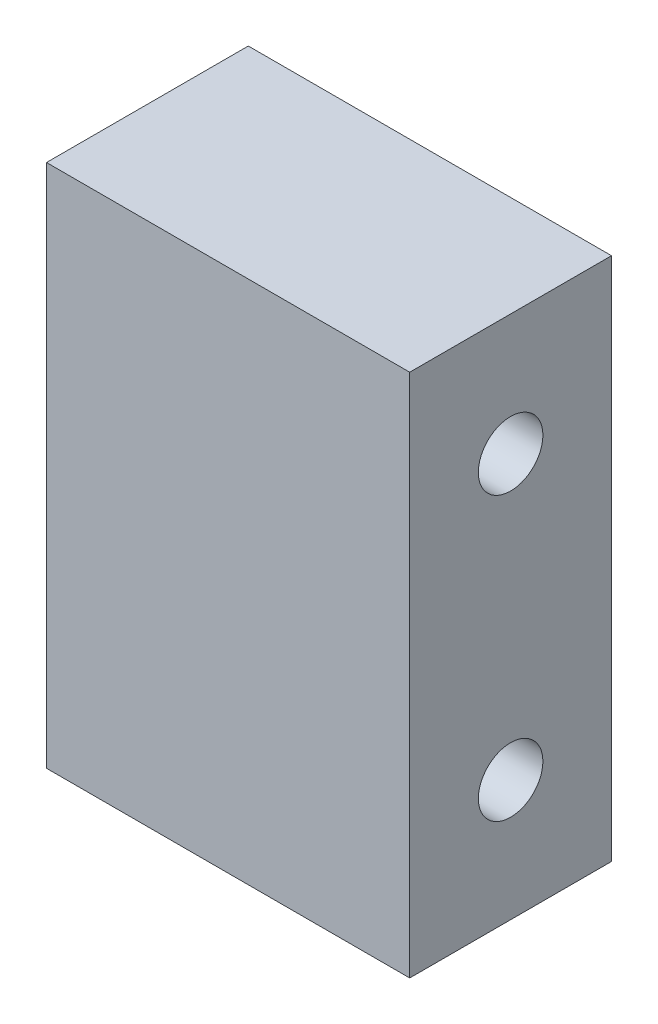
ISO-10303-21;
HEADER;
FILE_DESCRIPTION(('STEP AP214'),'2;1');
FILE_NAME('part.step','',(''),(''),'','','');
FILE_SCHEMA(('AUTOMOTIVE_DESIGN { 1 0 10303 214 1 1 1 1 }'));
ENDSEC;
DATA;
#1=APPLICATION_CONTEXT('core data for automotive mechanical design processes');
#2=APPLICATION_PROTOCOL_DEFINITION('international standard','automotive_design',2000,#1);
#3=PRODUCT_CONTEXT('',#1,'mechanical');
#4=PRODUCT('Part','Part','',(#3));
#5=PRODUCT_RELATED_PRODUCT_CATEGORY('part','',(#4));
#6=PRODUCT_DEFINITION_FORMATION('','',#4);
#7=PRODUCT_DEFINITION_CONTEXT('part definition',#1,'design');
#8=PRODUCT_DEFINITION('design','',#6,#7);
#9=PRODUCT_DEFINITION_SHAPE('','',#8);
#10=(LENGTH_UNIT() NAMED_UNIT(*) SI_UNIT(.MILLI.,.METRE.));
#11=(NAMED_UNIT(*) PLANE_ANGLE_UNIT() SI_UNIT($,.RADIAN.));
#12=(NAMED_UNIT(*) SI_UNIT($,.STERADIAN.) SOLID_ANGLE_UNIT());
#13=UNCERTAINTY_MEASURE_WITH_UNIT(LENGTH_MEASURE(1.E-05),#10,'distance_accuracy_value','');
#14=(GEOMETRIC_REPRESENTATION_CONTEXT(3) GLOBAL_UNCERTAINTY_ASSIGNED_CONTEXT((#13)) GLOBAL_UNIT_ASSIGNED_CONTEXT((#10,
#11,#12)) REPRESENTATION_CONTEXT('',''));
#15=CARTESIAN_POINT('',(0.,0.,0.));
#16=DIRECTION('',(0.,0.,1.));
#17=DIRECTION('',(1.,0.,0.));
#18=AXIS2_PLACEMENT_3D('',#15,#16,#17);
#19=CARTESIAN_POINT('',(0.,0.,25.));
#20=DIRECTION('',(1.,0.,0.));
#21=DIRECTION('',(0.,0.,-1.));
#22=AXIS2_PLACEMENT_3D('',#19,#20,#21);
#23=PLANE('',#22);
#24=DIRECTION('',(0.,-1.,0.));
#25=VECTOR('',#24,1.);
#26=CARTESIAN_POINT('',(0.,0.,0.));
#27=LINE('',#26,#25);
#28=CARTESIAN_POINT('',(0.,65.,0.));
#29=VERTEX_POINT('',#28);
#30=CARTESIAN_POINT('',(0.,0.,0.));
#31=VERTEX_POINT('',#30);
#32=EDGE_CURVE('E96',#29,#31,#27,.T.);
#33=ORIENTED_EDGE('',*,*,#32,.T.);
#34=DIRECTION('',(0.,0.,-1.));
#35=VECTOR('',#34,1.);
#36=CARTESIAN_POINT('',(0.,0.,25.));
#37=LINE('',#36,#35);
#38=CARTESIAN_POINT('',(0.,0.,25.));
#39=VERTEX_POINT('',#38);
#40=EDGE_CURVE('E11',#39,#31,#37,.T.);
#41=ORIENTED_EDGE('',*,*,#40,.F.);
#42=DIRECTION('',(0.,-1.,0.));
#43=VECTOR('',#42,1.);
#44=CARTESIAN_POINT('',(0.,0.,25.));
#45=LINE('',#44,#43);
#46=CARTESIAN_POINT('',(0.,65.,25.));
#47=VERTEX_POINT('',#46);
#48=EDGE_CURVE('E84',#47,#39,#45,.T.);
#49=ORIENTED_EDGE('',*,*,#48,.F.);
#50=DIRECTION('',(0.,0.,-1.));
#51=VECTOR('',#50,1.);
#52=CARTESIAN_POINT('',(0.,65.,25.));
#53=LINE('',#52,#51);
#54=EDGE_CURVE('E92',#47,#29,#53,.T.);
#55=ORIENTED_EDGE('',*,*,#54,.T.);
#56=EDGE_LOOP('',(#33,#41,#49,#55));
#57=FACE_BOUND('',#56,.T.);
#58=ADVANCED_FACE('F33',(#57),#23,.F.);
#59=CARTESIAN_POINT('',(0.,0.,25.));
#60=DIRECTION('',(0.,1.,0.));
#61=DIRECTION('',(0.,0.,1.));
#62=AXIS2_PLACEMENT_3D('',#59,#60,#61);
#63=PLANE('',#62);
#64=DIRECTION('',(1.,0.,0.));
#65=VECTOR('',#64,1.);
#66=CARTESIAN_POINT('',(0.,0.,0.));
#67=LINE('',#66,#65);
#68=CARTESIAN_POINT('',(45.,0.,0.));
#69=VERTEX_POINT('',#68);
#70=EDGE_CURVE('E88',#31,#69,#67,.T.);
#71=ORIENTED_EDGE('',*,*,#70,.T.);
#72=DIRECTION('',(0.,0.,-1.));
#73=VECTOR('',#72,1.);
#74=CARTESIAN_POINT('',(45.,0.,25.));
#75=LINE('',#74,#73);
#76=CARTESIAN_POINT('',(45.,0.,25.));
#77=VERTEX_POINT('',#76);
#78=EDGE_CURVE('E41',#77,#69,#75,.T.);
#79=ORIENTED_EDGE('',*,*,#78,.F.);
#80=DIRECTION('',(1.,0.,0.));
#81=VECTOR('',#80,1.);
#82=CARTESIAN_POINT('',(0.,0.,25.));
#83=LINE('',#82,#81);
#84=EDGE_CURVE('E79',#39,#77,#83,.T.);
#85=ORIENTED_EDGE('',*,*,#84,.F.);
#86=ORIENTED_EDGE('',*,*,#40,.T.);
#87=EDGE_LOOP('',(#71,#79,#85,#86));
#88=FACE_BOUND('',#87,.T.);
#89=ADVANCED_FACE('F87',(#88),#63,.F.);
#90=CARTESIAN_POINT('',(45.,0.,25.));
#91=DIRECTION('',(-1.,0.,0.));
#92=DIRECTION('',(0.,0.,1.));
#93=AXIS2_PLACEMENT_3D('',#90,#91,#92);
#94=PLANE('',#93);
#95=CARTESIAN_POINT('',(45.,15.,12.5));
#96=DIRECTION('',(1.,0.,0.));
#97=DIRECTION('',(0.,0.,-1.));
#98=AXIS2_PLACEMENT_3D('',#95,#96,#97);
#99=CIRCLE('',#98,4.);
#100=CARTESIAN_POINT('',(45.,15.,8.5));
#101=VERTEX_POINT('',#100);
#102=EDGE_CURVE('E116',#101,#101,#99,.T.);
#103=ORIENTED_EDGE('',*,*,#102,.F.);
#104=EDGE_LOOP('',(#103));
#105=FACE_BOUND('',#104,.T.);
#106=CARTESIAN_POINT('',(45.,50.,12.5));
#107=DIRECTION('',(1.,0.,0.));
#108=DIRECTION('',(0.,0.,-1.));
#109=AXIS2_PLACEMENT_3D('',#106,#107,#108);
#110=CIRCLE('',#109,4.);
#111=CARTESIAN_POINT('',(45.,50.,8.5));
#112=VERTEX_POINT('',#111);
#113=EDGE_CURVE('E110',#112,#112,#110,.T.);
#114=ORIENTED_EDGE('',*,*,#113,.F.);
#115=EDGE_LOOP('',(#114));
#116=FACE_BOUND('',#115,.T.);
#117=DIRECTION('',(0.,1.,0.));
#118=VECTOR('',#117,1.);
#119=CARTESIAN_POINT('',(45.,0.,0.));
#120=LINE('',#119,#118);
#121=CARTESIAN_POINT('',(45.,65.,0.));
#122=VERTEX_POINT('',#121);
#123=EDGE_CURVE('E66',#69,#122,#120,.T.);
#124=ORIENTED_EDGE('',*,*,#123,.T.);
#125=DIRECTION('',(0.,0.,-1.));
#126=VECTOR('',#125,1.);
#127=CARTESIAN_POINT('',(45.,65.,25.));
#128=LINE('',#127,#126);
#129=CARTESIAN_POINT('',(45.,65.,25.));
#130=VERTEX_POINT('',#129);
#131=EDGE_CURVE('E89',#130,#122,#128,.T.);
#132=ORIENTED_EDGE('',*,*,#131,.F.);
#133=DIRECTION('',(0.,1.,0.));
#134=VECTOR('',#133,1.);
#135=CARTESIAN_POINT('',(45.,0.,25.));
#136=LINE('',#135,#134);
#137=EDGE_CURVE('E82',#77,#130,#136,.T.);
#138=ORIENTED_EDGE('',*,*,#137,.F.);
#139=ORIENTED_EDGE('',*,*,#78,.T.);
#140=EDGE_LOOP('',(#124,#132,#138,#139));
#141=FACE_BOUND('',#140,.T.);
#142=ADVANCED_FACE('F90',(#105,#116,#141),#94,.F.);
#143=CARTESIAN_POINT('',(0.,65.,25.));
#144=DIRECTION('',(0.,-1.,0.));
#145=DIRECTION('',(0.,0.,-1.));
#146=AXIS2_PLACEMENT_3D('',#143,#144,#145);
#147=PLANE('',#146);
#148=DIRECTION('',(-1.,0.,0.));
#149=VECTOR('',#148,1.);
#150=CARTESIAN_POINT('',(0.,65.,0.));
#151=LINE('',#150,#149);
#152=EDGE_CURVE('E72',#122,#29,#151,.T.);
#153=ORIENTED_EDGE('',*,*,#152,.T.);
#154=ORIENTED_EDGE('',*,*,#54,.F.);
#155=DIRECTION('',(-1.,0.,0.));
#156=VECTOR('',#155,1.);
#157=CARTESIAN_POINT('',(0.,65.,25.));
#158=LINE('',#157,#156);
#159=EDGE_CURVE('E49',#130,#47,#158,.T.);
#160=ORIENTED_EDGE('',*,*,#159,.F.);
#161=ORIENTED_EDGE('',*,*,#131,.T.);
#162=EDGE_LOOP('',(#153,#154,#160,#161));
#163=FACE_BOUND('',#162,.T.);
#164=ADVANCED_FACE('F104',(#163),#147,.F.);
#165=CARTESIAN_POINT('',(0.,0.,25.));
#166=DIRECTION('',(0.,0.,-1.));
#167=DIRECTION('',(-1.,0.,0.));
#168=AXIS2_PLACEMENT_3D('',#165,#166,#167);
#169=PLANE('',#168);
#170=ORIENTED_EDGE('',*,*,#48,.T.);
#171=ORIENTED_EDGE('',*,*,#84,.T.);
#172=ORIENTED_EDGE('',*,*,#137,.T.);
#173=ORIENTED_EDGE('',*,*,#159,.T.);
#174=EDGE_LOOP('',(#170,#171,#172,#173));
#175=FACE_BOUND('',#174,.T.);
#176=ADVANCED_FACE('F80',(#175),#169,.F.);
#177=CARTESIAN_POINT('',(0.,0.,0.));
#178=DIRECTION('',(0.,0.,-1.));
#179=DIRECTION('',(-1.,0.,0.));
#180=AXIS2_PLACEMENT_3D('',#177,#178,#179);
#181=PLANE('',#180);
#182=ORIENTED_EDGE('',*,*,#32,.F.);
#183=ORIENTED_EDGE('',*,*,#152,.F.);
#184=ORIENTED_EDGE('',*,*,#123,.F.);
#185=ORIENTED_EDGE('',*,*,#70,.F.);
#186=EDGE_LOOP('',(#182,#183,#184,#185));
#187=FACE_BOUND('',#186,.T.);
#188=ADVANCED_FACE('F107',(#187),#181,.T.);
#189=CARTESIAN_POINT('',(20.,50.,12.5));
#190=DIRECTION('',(1.,0.,0.));
#191=DIRECTION('',(0.,0.,-1.));
#192=AXIS2_PLACEMENT_3D('',#189,#190,#191);
#193=CYLINDRICAL_SURFACE('',#192,4.);
#194=CARTESIAN_POINT('',(20.,50.,12.5));
#195=DIRECTION('',(1.,0.,0.));
#196=DIRECTION('',(0.,0.,-1.));
#197=AXIS2_PLACEMENT_3D('',#194,#195,#196);
#198=CIRCLE('',#197,4.);
#199=CARTESIAN_POINT('',(20.,50.,8.5));
#200=VERTEX_POINT('',#199);
#201=EDGE_CURVE('E99',#200,#200,#198,.T.);
#202=ORIENTED_EDGE('',*,*,#201,.F.);
#203=EDGE_LOOP('',(#202));
#204=FACE_BOUND('',#203,.T.);
#205=ORIENTED_EDGE('',*,*,#113,.T.);
#206=EDGE_LOOP('',(#205));
#207=FACE_BOUND('',#206,.T.);
#208=ADVANCED_FACE('F136',(#204,#207),#193,.F.);
#209=CARTESIAN_POINT('',(20.,50.,12.5));
#210=DIRECTION('',(1.,0.,0.));
#211=DIRECTION('',(0.,0.,-1.));
#212=AXIS2_PLACEMENT_3D('',#209,#210,#211);
#213=PLANE('',#212);
#214=ORIENTED_EDGE('',*,*,#201,.T.);
#215=EDGE_LOOP('',(#214));
#216=FACE_BOUND('',#215,.T.);
#217=ADVANCED_FACE('F127',(#216),#213,.T.);
#218=CARTESIAN_POINT('',(20.,15.,12.5));
#219=DIRECTION('',(1.,0.,0.));
#220=DIRECTION('',(0.,0.,-1.));
#221=AXIS2_PLACEMENT_3D('',#218,#219,#220);
#222=CYLINDRICAL_SURFACE('',#221,4.);
#223=CARTESIAN_POINT('',(20.,15.,12.5));
#224=DIRECTION('',(1.,0.,0.));
#225=DIRECTION('',(0.,0.,-1.));
#226=AXIS2_PLACEMENT_3D('',#223,#224,#225);
#227=CIRCLE('',#226,4.);
#228=CARTESIAN_POINT('',(20.,15.,8.5));
#229=VERTEX_POINT('',#228);
#230=EDGE_CURVE('E113',#229,#229,#227,.T.);
#231=ORIENTED_EDGE('',*,*,#230,.F.);
#232=EDGE_LOOP('',(#231));
#233=FACE_BOUND('',#232,.T.);
#234=ORIENTED_EDGE('',*,*,#102,.T.);
#235=EDGE_LOOP('',(#234));
#236=FACE_BOUND('',#235,.T.);
#237=ADVANCED_FACE('F124',(#233,#236),#222,.F.);
#238=CARTESIAN_POINT('',(20.,15.,12.5));
#239=DIRECTION('',(1.,0.,0.));
#240=DIRECTION('',(0.,0.,-1.));
#241=AXIS2_PLACEMENT_3D('',#238,#239,#240);
#242=PLANE('',#241);
#243=ORIENTED_EDGE('',*,*,#230,.T.);
#244=EDGE_LOOP('',(#243));
#245=FACE_BOUND('',#244,.T.);
#246=ADVANCED_FACE('F122',(#245),#242,.T.);
#247=CLOSED_SHELL('',(#58,#89,#142,#164,#176,#188,#208,#217,#237,#246));
#248=MANIFOLD_SOLID_BREP('B2',#247);
#249=ADVANCED_BREP_SHAPE_REPRESENTATION('',(#18,#248),#14);
#250=SHAPE_DEFINITION_REPRESENTATION(#9,#249);
ENDSEC;
END-ISO-10303-21;
